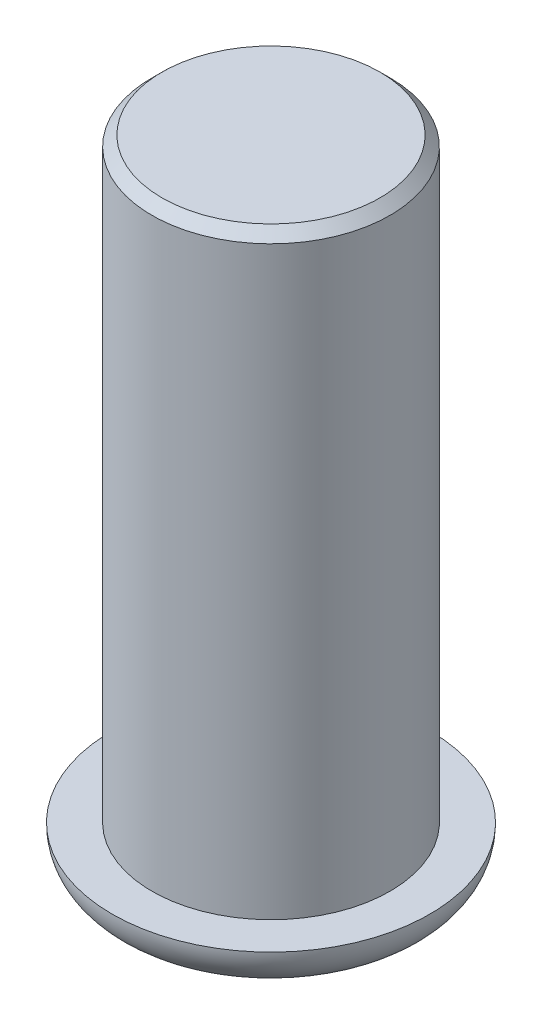
ISO-10303-21;
HEADER;
FILE_DESCRIPTION(('STEP AP214'),'2;1');
FILE_NAME('part.step','',(''),(''),'','','');
FILE_SCHEMA(('AUTOMOTIVE_DESIGN { 1 0 10303 214 1 1 1 1 }'));
ENDSEC;
DATA;
#1=APPLICATION_CONTEXT('core data for automotive mechanical design processes');
#2=APPLICATION_PROTOCOL_DEFINITION('international standard','automotive_design',2000,#1);
#3=PRODUCT_CONTEXT('',#1,'mechanical');
#4=PRODUCT('Part','Part','',(#3));
#5=PRODUCT_RELATED_PRODUCT_CATEGORY('part','',(#4));
#6=PRODUCT_DEFINITION_FORMATION('','',#4);
#7=PRODUCT_DEFINITION_CONTEXT('part definition',#1,'design');
#8=PRODUCT_DEFINITION('design','',#6,#7);
#9=PRODUCT_DEFINITION_SHAPE('','',#8);
#10=(LENGTH_UNIT() NAMED_UNIT(*) SI_UNIT(.MILLI.,.METRE.));
#11=(NAMED_UNIT(*) PLANE_ANGLE_UNIT() SI_UNIT($,.RADIAN.));
#12=(NAMED_UNIT(*) SI_UNIT($,.STERADIAN.) SOLID_ANGLE_UNIT());
#13=UNCERTAINTY_MEASURE_WITH_UNIT(LENGTH_MEASURE(1.E-05),#10,'distance_accuracy_value','');
#14=(GEOMETRIC_REPRESENTATION_CONTEXT(3) GLOBAL_UNCERTAINTY_ASSIGNED_CONTEXT((#13)) GLOBAL_UNIT_ASSIGNED_CONTEXT((#10,
#11,#12)) REPRESENTATION_CONTEXT('',''));
#15=CARTESIAN_POINT('',(0.,0.,0.));
#16=DIRECTION('',(0.,0.,1.));
#17=DIRECTION('',(1.,0.,0.));
#18=AXIS2_PLACEMENT_3D('',#15,#16,#17);
#19=CARTESIAN_POINT('',(3.34928965330878,0.,0.));
#20=DIRECTION('',(0.,-1.,0.));
#21=DIRECTION('',(0.,0.,-1.));
#22=AXIS2_PLACEMENT_3D('',#19,#20,#21);
#23=PLANE('',#22);
#24=CARTESIAN_POINT('',(0.,0.,0.));
#25=DIRECTION('',(0.,-1.,0.));
#26=DIRECTION('',(0.,0.,-1.));
#27=AXIS2_PLACEMENT_3D('',#24,#25,#26);
#28=CIRCLE('',#27,3.34928965330878);
#29=CARTESIAN_POINT('',(0.,0.,-3.34928965330878));
#30=VERTEX_POINT('',#29);
#31=EDGE_CURVE('E18',#30,#30,#28,.F.);
#32=ORIENTED_EDGE('',*,*,#31,.F.);
#33=EDGE_LOOP('',(#32));
#34=FACE_BOUND('',#33,.T.);
#35=ADVANCED_FACE('F15',(#34),#23,.T.);
#36=CARTESIAN_POINT('',(0.,16.,0.));
#37=DIRECTION('',(0.,1.,0.));
#38=DIRECTION('',(0.,0.,1.));
#39=AXIS2_PLACEMENT_3D('',#36,#37,#38);
#40=PLANE('',#39);
#41=CARTESIAN_POINT('',(0.,15.9999999999627,0.));
#42=DIRECTION('',(0.,-1.,0.));
#43=DIRECTION('',(0.,0.,-1.));
#44=AXIS2_PLACEMENT_3D('',#41,#42,#43);
#45=CIRCLE('',#44,2.74600000000191);
#46=CARTESIAN_POINT('',(0.,15.9999999999627,-2.74600000000191));
#47=VERTEX_POINT('',#46);
#48=EDGE_CURVE('E33',#47,#47,#45,.T.);
#49=ORIENTED_EDGE('',*,*,#48,.F.);
#50=EDGE_LOOP('',(#49));
#51=FACE_BOUND('',#50,.T.);
#52=ADVANCED_FACE('F43',(#51),#40,.T.);
#53=CARTESIAN_POINT('',(0.,1.,0.));
#54=DIRECTION('',(0.,-1.,0.));
#55=DIRECTION('',(0.,0.,-1.));
#56=AXIS2_PLACEMENT_3D('',#53,#54,#55);
#57=TOROIDAL_SURFACE('',#56,2.90625378670484,1.09374621329516);
#58=CARTESIAN_POINT('',(0.,1.,0.));
#59=DIRECTION('',(0.,-1.,0.));
#60=DIRECTION('',(0.,0.,-1.));
#61=AXIS2_PLACEMENT_3D('',#58,#59,#60);
#62=CIRCLE('',#61,4.);
#63=CARTESIAN_POINT('',(0.,1.,-4.));
#64=VERTEX_POINT('',#63);
#65=EDGE_CURVE('E27',#64,#64,#62,.F.);
#66=ORIENTED_EDGE('',*,*,#65,.F.);
#67=EDGE_LOOP('',(#66));
#68=FACE_BOUND('',#67,.T.);
#69=ORIENTED_EDGE('',*,*,#31,.T.);
#70=EDGE_LOOP('',(#69));
#71=FACE_BOUND('',#70,.T.);
#72=ADVANCED_FACE('F40',(#68,#71),#57,.T.);
#73=CARTESIAN_POINT('',(0.,15.7460000000356,0.));
#74=DIRECTION('',(0.,-1.,0.));
#75=DIRECTION('',(0.,0.,-1.));
#76=AXIS2_PLACEMENT_3D('',#73,#74,#75);
#77=CONICAL_SURFACE('',#76,2.99999999992906,0.785398163397448);
#78=CARTESIAN_POINT('',(0.,15.746,0.));
#79=DIRECTION('',(0.,-1.,0.));
#80=DIRECTION('',(0.,0.,-1.));
#81=AXIS2_PLACEMENT_3D('',#78,#79,#80);
#82=CIRCLE('',#81,3.);
#83=CARTESIAN_POINT('',(0.,15.746,-3.));
#84=VERTEX_POINT('',#83);
#85=EDGE_CURVE('E22',#84,#84,#82,.T.);
#86=ORIENTED_EDGE('',*,*,#85,.F.);
#87=EDGE_LOOP('',(#86));
#88=FACE_BOUND('',#87,.T.);
#89=ORIENTED_EDGE('',*,*,#48,.T.);
#90=EDGE_LOOP('',(#89));
#91=FACE_BOUND('',#90,.T.);
#92=ADVANCED_FACE('F56',(#88,#91),#77,.T.);
#93=CARTESIAN_POINT('',(4.,1.,0.));
#94=DIRECTION('',(0.,1.,0.));
#95=DIRECTION('',(0.,0.,1.));
#96=AXIS2_PLACEMENT_3D('',#93,#94,#95);
#97=PLANE('',#96);
#98=ORIENTED_EDGE('',*,*,#65,.T.);
#99=EDGE_LOOP('',(#98));
#100=FACE_BOUND('',#99,.T.);
#101=CARTESIAN_POINT('',(0.,1.,0.));
#102=DIRECTION('',(0.,-1.,0.));
#103=DIRECTION('',(0.,0.,-1.));
#104=AXIS2_PLACEMENT_3D('',#101,#102,#103);
#105=CIRCLE('',#104,3.);
#106=CARTESIAN_POINT('',(0.,1.,-3.));
#107=VERTEX_POINT('',#106);
#108=EDGE_CURVE('E10',#107,#107,#105,.F.);
#109=ORIENTED_EDGE('',*,*,#108,.F.);
#110=EDGE_LOOP('',(#109));
#111=FACE_BOUND('',#110,.T.);
#112=ADVANCED_FACE('F51',(#100,#111),#97,.T.);
#113=CARTESIAN_POINT('',(0.,0.,0.));
#114=DIRECTION('',(0.,-1.,0.));
#115=DIRECTION('',(0.,0.,-1.));
#116=AXIS2_PLACEMENT_3D('',#113,#114,#115);
#117=CYLINDRICAL_SURFACE('',#116,3.);
#118=ORIENTED_EDGE('',*,*,#108,.T.);
#119=EDGE_LOOP('',(#118));
#120=FACE_BOUND('',#119,.T.);
#121=ORIENTED_EDGE('',*,*,#85,.T.);
#122=EDGE_LOOP('',(#121));
#123=FACE_BOUND('',#122,.T.);
#124=ADVANCED_FACE('F49',(#120,#123),#117,.T.);
#125=CLOSED_SHELL('',(#35,#52,#72,#92,#112,#124));
#126=MANIFOLD_SOLID_BREP('B1',#125);
#127=ADVANCED_BREP_SHAPE_REPRESENTATION('',(#18,#126),#14);
#128=SHAPE_DEFINITION_REPRESENTATION(#9,#127);
ENDSEC;
END-ISO-10303-21;
